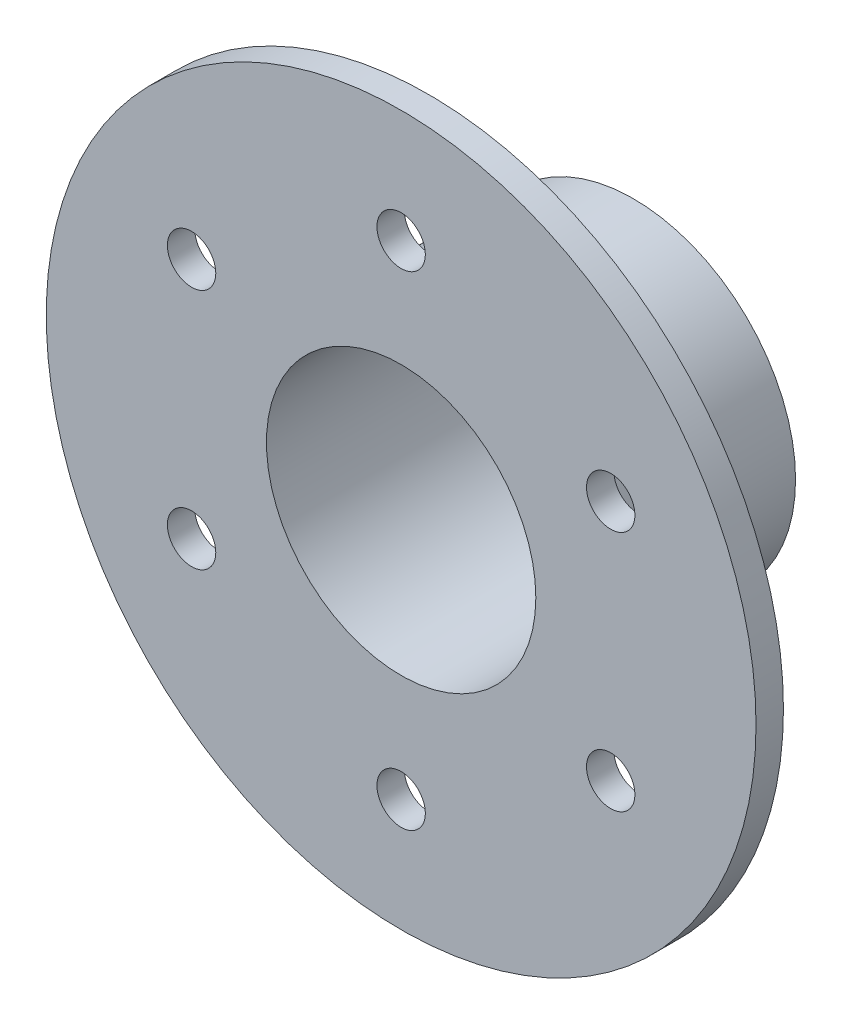
ISO-10303-21;
HEADER;
FILE_DESCRIPTION(('STEP AP214'),'2;1');
FILE_NAME('part.step','',(''),(''),'','','');
FILE_SCHEMA(('AUTOMOTIVE_DESIGN { 1 0 10303 214 1 1 1 1 }'));
ENDSEC;
DATA;
#1=APPLICATION_CONTEXT('core data for automotive mechanical design processes');
#2=APPLICATION_PROTOCOL_DEFINITION('international standard','automotive_design',2000,#1);
#3=PRODUCT_CONTEXT('',#1,'mechanical');
#4=PRODUCT('Part','Part','',(#3));
#5=PRODUCT_RELATED_PRODUCT_CATEGORY('part','',(#4));
#6=PRODUCT_DEFINITION_FORMATION('','',#4);
#7=PRODUCT_DEFINITION_CONTEXT('part definition',#1,'design');
#8=PRODUCT_DEFINITION('design','',#6,#7);
#9=PRODUCT_DEFINITION_SHAPE('','',#8);
#10=(LENGTH_UNIT() NAMED_UNIT(*) SI_UNIT(.MILLI.,.METRE.));
#11=(NAMED_UNIT(*) PLANE_ANGLE_UNIT() SI_UNIT($,.RADIAN.));
#12=(NAMED_UNIT(*) SI_UNIT($,.STERADIAN.) SOLID_ANGLE_UNIT());
#13=UNCERTAINTY_MEASURE_WITH_UNIT(LENGTH_MEASURE(1.E-05),#10,'distance_accuracy_value','');
#14=(GEOMETRIC_REPRESENTATION_CONTEXT(3) GLOBAL_UNCERTAINTY_ASSIGNED_CONTEXT((#13)) GLOBAL_UNIT_ASSIGNED_CONTEXT((#10,
#11,#12)) REPRESENTATION_CONTEXT('',''));
#15=CARTESIAN_POINT('',(0.,0.,0.));
#16=DIRECTION('',(0.,0.,1.));
#17=DIRECTION('',(1.,0.,0.));
#18=AXIS2_PLACEMENT_3D('',#15,#16,#17);
#19=CARTESIAN_POINT('',(0.,0.,0.));
#20=DIRECTION('',(0.,0.,1.));
#21=DIRECTION('',(1.,0.,0.));
#22=AXIS2_PLACEMENT_3D('',#19,#20,#21);
#23=PLANE('',#22);
#24=CARTESIAN_POINT('',(0.,0.,0.));
#25=DIRECTION('',(0.,0.,1.));
#26=DIRECTION('',(1.,0.,0.));
#27=AXIS2_PLACEMENT_3D('',#24,#25,#26);
#28=CIRCLE('',#27,20.1);
#29=CARTESIAN_POINT('',(20.1,0.,0.));
#30=VERTEX_POINT('',#29);
#31=EDGE_CURVE('E35',#30,#30,#28,.T.);
#32=ORIENTED_EDGE('',*,*,#31,.F.);
#33=EDGE_LOOP('',(#32));
#34=FACE_BOUND('',#33,.T.);
#35=CARTESIAN_POINT('',(0.,0.,0.));
#36=DIRECTION('',(0.,0.,1.));
#37=DIRECTION('',(1.,0.,0.));
#38=AXIS2_PLACEMENT_3D('',#35,#36,#37);
#39=CIRCLE('',#38,16.7);
#40=CARTESIAN_POINT('',(16.7,0.,0.));
#41=VERTEX_POINT('',#40);
#42=EDGE_CURVE('E42',#41,#41,#39,.T.);
#43=ORIENTED_EDGE('',*,*,#42,.T.);
#44=EDGE_LOOP('',(#43));
#45=FACE_BOUND('',#44,.T.);
#46=ADVANCED_FACE('F31',(#34,#45),#23,.F.);
#47=CARTESIAN_POINT('',(0.,0.,25.4));
#48=DIRECTION('',(0.,0.,-1.));
#49=DIRECTION('',(-1.,0.,0.));
#50=AXIS2_PLACEMENT_3D('',#47,#48,#49);
#51=CYLINDRICAL_SURFACE('',#50,20.1);
#52=CARTESIAN_POINT('',(0.,0.,25.4));
#53=DIRECTION('',(0.,0.,1.));
#54=DIRECTION('',(1.,0.,0.));
#55=AXIS2_PLACEMENT_3D('',#52,#53,#54);
#56=CIRCLE('',#55,20.1);
#57=CARTESIAN_POINT('',(20.1,0.,25.4));
#58=VERTEX_POINT('',#57);
#59=EDGE_CURVE('E10',#58,#58,#56,.T.);
#60=ORIENTED_EDGE('',*,*,#59,.F.);
#61=EDGE_LOOP('',(#60));
#62=FACE_BOUND('',#61,.T.);
#63=ORIENTED_EDGE('',*,*,#31,.T.);
#64=EDGE_LOOP('',(#63));
#65=FACE_BOUND('',#64,.T.);
#66=ADVANCED_FACE('F33',(#62,#65),#51,.T.);
#67=CARTESIAN_POINT('',(0.,0.,25.4));
#68=DIRECTION('',(0.,0.,-1.));
#69=DIRECTION('',(-1.,0.,0.));
#70=AXIS2_PLACEMENT_3D('',#67,#68,#69);
#71=CYLINDRICAL_SURFACE('',#70,16.7);
#72=ORIENTED_EDGE('',*,*,#42,.F.);
#73=EDGE_LOOP('',(#72));
#74=FACE_BOUND('',#73,.T.);
#75=CARTESIAN_POINT('',(0.,0.,28.8));
#76=DIRECTION('',(0.,0.,1.));
#77=DIRECTION('',(1.,0.,0.));
#78=AXIS2_PLACEMENT_3D('',#75,#76,#77);
#79=CIRCLE('',#78,16.7);
#80=CARTESIAN_POINT('',(16.7,0.,28.8));
#81=VERTEX_POINT('',#80);
#82=EDGE_CURVE('E50',#81,#81,#79,.T.);
#83=ORIENTED_EDGE('',*,*,#82,.T.);
#84=EDGE_LOOP('',(#83));
#85=FACE_BOUND('',#84,.T.);
#86=ADVANCED_FACE('F98',(#74,#85),#71,.F.);
#87=CARTESIAN_POINT('',(0.,0.,28.8));
#88=DIRECTION('',(0.,0.,1.));
#89=DIRECTION('',(1.,0.,0.));
#90=AXIS2_PLACEMENT_3D('',#87,#88,#89);
#91=PLANE('',#90);
#92=CARTESIAN_POINT('',(-25.9807621135306,-15.0000000000015,28.8));
#93=DIRECTION('',(0.,0.,1.));
#94=DIRECTION('',(1.,0.,0.));
#95=AXIS2_PLACEMENT_3D('',#92,#93,#94);
#96=CIRCLE('',#95,3.00000000000316);
#97=CARTESIAN_POINT('',(-22.9807621135274,-15.0000000000015,28.8));
#98=VERTEX_POINT('',#97);
#99=EDGE_CURVE('E77',#98,#98,#96,.T.);
#100=ORIENTED_EDGE('',*,*,#99,.F.);
#101=EDGE_LOOP('',(#100));
#102=FACE_BOUND('',#101,.T.);
#103=CARTESIAN_POINT('',(25.9807621135357,-14.9999999999985,28.8));
#104=DIRECTION('',(0.,0.,1.));
#105=DIRECTION('',(1.,0.,0.));
#106=AXIS2_PLACEMENT_3D('',#103,#104,#105);
#107=CIRCLE('',#106,3.00000000000215);
#108=CARTESIAN_POINT('',(28.9807621135379,-14.9999999999985,28.8));
#109=VERTEX_POINT('',#108);
#110=EDGE_CURVE('E65',#109,#109,#107,.T.);
#111=ORIENTED_EDGE('',*,*,#110,.F.);
#112=EDGE_LOOP('',(#111));
#113=FACE_BOUND('',#112,.T.);
#114=CARTESIAN_POINT('',(25.980762113534,15.0000000000015,28.8));
#115=DIRECTION('',(0.,0.,1.));
#116=DIRECTION('',(1.,0.,0.));
#117=AXIS2_PLACEMENT_3D('',#114,#115,#116);
#118=CIRCLE('',#117,3.00000000000046);
#119=CARTESIAN_POINT('',(28.9807621135345,15.0000000000015,28.8));
#120=VERTEX_POINT('',#119);
#121=EDGE_CURVE('E55',#120,#120,#118,.T.);
#122=ORIENTED_EDGE('',*,*,#121,.F.);
#123=EDGE_LOOP('',(#122));
#124=FACE_BOUND('',#123,.T.);
#125=CARTESIAN_POINT('',(0.,0.,28.8));
#126=DIRECTION('',(0.,0.,1.));
#127=DIRECTION('',(1.,0.,0.));
#128=AXIS2_PLACEMENT_3D('',#125,#126,#127);
#129=CIRCLE('',#128,44.);
#130=CARTESIAN_POINT('',(44.,0.,28.8));
#131=VERTEX_POINT('',#130);
#132=EDGE_CURVE('E46',#131,#131,#129,.T.);
#133=ORIENTED_EDGE('',*,*,#132,.T.);
#134=EDGE_LOOP('',(#133));
#135=FACE_BOUND('',#134,.T.);
#136=ORIENTED_EDGE('',*,*,#82,.F.);
#137=EDGE_LOOP('',(#136));
#138=FACE_BOUND('',#137,.T.);
#139=CARTESIAN_POINT('',(0.,30.,28.8));
#140=DIRECTION('',(0.,0.,1.));
#141=DIRECTION('',(1.,0.,0.));
#142=AXIS2_PLACEMENT_3D('',#139,#140,#141);
#143=CIRCLE('',#142,3.);
#144=CARTESIAN_POINT('',(3.,30.,28.8));
#145=VERTEX_POINT('',#144);
#146=EDGE_CURVE('E59',#145,#145,#143,.T.);
#147=ORIENTED_EDGE('',*,*,#146,.F.);
#148=EDGE_LOOP('',(#147));
#149=FACE_BOUND('',#148,.T.);
#150=CARTESIAN_POINT('',(3.4032572508536E-12,-30.,28.8));
#151=DIRECTION('',(0.,0.,1.));
#152=DIRECTION('',(1.,0.,0.));
#153=AXIS2_PLACEMENT_3D('',#150,#151,#152);
#154=CIRCLE('',#153,3.00000000000345);
#155=CARTESIAN_POINT('',(3.00000000000686,-30.,28.8));
#156=VERTEX_POINT('',#155);
#157=EDGE_CURVE('E71',#156,#156,#154,.T.);
#158=ORIENTED_EDGE('',*,*,#157,.F.);
#159=EDGE_LOOP('',(#158));
#160=FACE_BOUND('',#159,.T.);
#161=CARTESIAN_POINT('',(-25.9807621135323,14.9999999999985,28.8));
#162=DIRECTION('',(0.,0.,1.));
#163=DIRECTION('',(1.,0.,0.));
#164=AXIS2_PLACEMENT_3D('',#161,#162,#163);
#165=CIRCLE('',#164,3.0000000000016);
#166=CARTESIAN_POINT('',(-22.9807621135307,14.9999999999985,28.8));
#167=VERTEX_POINT('',#166);
#168=EDGE_CURVE('E83',#167,#167,#165,.T.);
#169=ORIENTED_EDGE('',*,*,#168,.F.);
#170=EDGE_LOOP('',(#169));
#171=FACE_BOUND('',#170,.T.);
#172=ADVANCED_FACE('F95',(#102,#113,#124,#135,#138,#149,#160,#171),#91,.T.);
#173=CARTESIAN_POINT('',(0.,0.,25.4));
#174=DIRECTION('',(0.,0.,1.));
#175=DIRECTION('',(1.,0.,0.));
#176=AXIS2_PLACEMENT_3D('',#173,#174,#175);
#177=PLANE('',#176);
#178=ORIENTED_EDGE('',*,*,#59,.T.);
#179=EDGE_LOOP('',(#178));
#180=FACE_BOUND('',#179,.T.);
#181=CARTESIAN_POINT('',(0.,0.,25.4));
#182=DIRECTION('',(0.,0.,1.));
#183=DIRECTION('',(1.,0.,0.));
#184=AXIS2_PLACEMENT_3D('',#181,#182,#183);
#185=CIRCLE('',#184,44.);
#186=CARTESIAN_POINT('',(44.,0.,25.4));
#187=VERTEX_POINT('',#186);
#188=EDGE_CURVE('E47',#187,#187,#185,.T.);
#189=ORIENTED_EDGE('',*,*,#188,.F.);
#190=EDGE_LOOP('',(#189));
#191=FACE_BOUND('',#190,.T.);
#192=CARTESIAN_POINT('',(25.980762113534,15.0000000000015,25.4));
#193=DIRECTION('',(0.,0.,1.));
#194=DIRECTION('',(1.,0.,0.));
#195=AXIS2_PLACEMENT_3D('',#192,#193,#194);
#196=CIRCLE('',#195,3.00000000000046);
#197=CARTESIAN_POINT('',(28.9807621135345,15.0000000000015,25.4));
#198=VERTEX_POINT('',#197);
#199=EDGE_CURVE('E56',#198,#198,#196,.T.);
#200=ORIENTED_EDGE('',*,*,#199,.T.);
#201=EDGE_LOOP('',(#200));
#202=FACE_BOUND('',#201,.T.);
#203=CARTESIAN_POINT('',(0.,30.,25.4));
#204=DIRECTION('',(0.,0.,1.));
#205=DIRECTION('',(1.,0.,0.));
#206=AXIS2_PLACEMENT_3D('',#203,#204,#205);
#207=CIRCLE('',#206,3.);
#208=CARTESIAN_POINT('',(3.,30.,25.4));
#209=VERTEX_POINT('',#208);
#210=EDGE_CURVE('E62',#209,#209,#207,.T.);
#211=ORIENTED_EDGE('',*,*,#210,.T.);
#212=EDGE_LOOP('',(#211));
#213=FACE_BOUND('',#212,.T.);
#214=CARTESIAN_POINT('',(25.9807621135357,-14.9999999999985,25.4));
#215=DIRECTION('',(0.,0.,1.));
#216=DIRECTION('',(1.,0.,0.));
#217=AXIS2_PLACEMENT_3D('',#214,#215,#216);
#218=CIRCLE('',#217,3.00000000000215);
#219=CARTESIAN_POINT('',(28.9807621135379,-14.9999999999985,25.4));
#220=VERTEX_POINT('',#219);
#221=EDGE_CURVE('E68',#220,#220,#218,.T.);
#222=ORIENTED_EDGE('',*,*,#221,.T.);
#223=EDGE_LOOP('',(#222));
#224=FACE_BOUND('',#223,.T.);
#225=CARTESIAN_POINT('',(3.4032572508536E-12,-30.,25.4));
#226=DIRECTION('',(0.,0.,1.));
#227=DIRECTION('',(1.,0.,0.));
#228=AXIS2_PLACEMENT_3D('',#225,#226,#227);
#229=CIRCLE('',#228,3.00000000000345);
#230=CARTESIAN_POINT('',(3.00000000000686,-30.,25.4));
#231=VERTEX_POINT('',#230);
#232=EDGE_CURVE('E74',#231,#231,#229,.T.);
#233=ORIENTED_EDGE('',*,*,#232,.T.);
#234=EDGE_LOOP('',(#233));
#235=FACE_BOUND('',#234,.T.);
#236=CARTESIAN_POINT('',(-25.9807621135306,-15.0000000000015,25.4));
#237=DIRECTION('',(0.,0.,1.));
#238=DIRECTION('',(1.,0.,0.));
#239=AXIS2_PLACEMENT_3D('',#236,#237,#238);
#240=CIRCLE('',#239,3.00000000000316);
#241=CARTESIAN_POINT('',(-22.9807621135274,-15.0000000000015,25.4));
#242=VERTEX_POINT('',#241);
#243=EDGE_CURVE('E80',#242,#242,#240,.T.);
#244=ORIENTED_EDGE('',*,*,#243,.T.);
#245=EDGE_LOOP('',(#244));
#246=FACE_BOUND('',#245,.T.);
#247=CARTESIAN_POINT('',(-25.9807621135323,14.9999999999985,25.4));
#248=DIRECTION('',(0.,0.,1.));
#249=DIRECTION('',(1.,0.,0.));
#250=AXIS2_PLACEMENT_3D('',#247,#248,#249);
#251=CIRCLE('',#250,3.0000000000016);
#252=CARTESIAN_POINT('',(-22.9807621135307,14.9999999999985,25.4));
#253=VERTEX_POINT('',#252);
#254=EDGE_CURVE('E86',#253,#253,#251,.T.);
#255=ORIENTED_EDGE('',*,*,#254,.T.);
#256=EDGE_LOOP('',(#255));
#257=FACE_BOUND('',#256,.T.);
#258=ADVANCED_FACE('F97',(#180,#191,#202,#213,#224,#235,#246,#257),#177,.F.);
#259=CARTESIAN_POINT('',(0.,0.,28.8));
#260=DIRECTION('',(0.,0.,-1.));
#261=DIRECTION('',(-1.,0.,0.));
#262=AXIS2_PLACEMENT_3D('',#259,#260,#261);
#263=CYLINDRICAL_SURFACE('',#262,44.);
#264=ORIENTED_EDGE('',*,*,#132,.F.);
#265=EDGE_LOOP('',(#264));
#266=FACE_BOUND('',#265,.T.);
#267=ORIENTED_EDGE('',*,*,#188,.T.);
#268=EDGE_LOOP('',(#267));
#269=FACE_BOUND('',#268,.T.);
#270=ADVANCED_FACE('F105',(#266,#269),#263,.T.);
#271=CARTESIAN_POINT('',(25.980762113534,15.0000000000015,28.8));
#272=DIRECTION('',(0.,0.,-1.));
#273=DIRECTION('',(-1.,0.,0.));
#274=AXIS2_PLACEMENT_3D('',#271,#272,#273);
#275=CYLINDRICAL_SURFACE('',#274,3.00000000000046);
#276=ORIENTED_EDGE('',*,*,#121,.T.);
#277=EDGE_LOOP('',(#276));
#278=FACE_BOUND('',#277,.T.);
#279=ORIENTED_EDGE('',*,*,#199,.F.);
#280=EDGE_LOOP('',(#279));
#281=FACE_BOUND('',#280,.T.);
#282=ADVANCED_FACE('F122',(#278,#281),#275,.F.);
#283=CARTESIAN_POINT('',(0.,30.,28.8));
#284=DIRECTION('',(0.,0.,-1.));
#285=DIRECTION('',(-1.,0.,0.));
#286=AXIS2_PLACEMENT_3D('',#283,#284,#285);
#287=CYLINDRICAL_SURFACE('',#286,3.);
#288=ORIENTED_EDGE('',*,*,#146,.T.);
#289=EDGE_LOOP('',(#288));
#290=FACE_BOUND('',#289,.T.);
#291=ORIENTED_EDGE('',*,*,#210,.F.);
#292=EDGE_LOOP('',(#291));
#293=FACE_BOUND('',#292,.T.);
#294=ADVANCED_FACE('F127',(#290,#293),#287,.F.);
#295=CARTESIAN_POINT('',(25.9807621135357,-14.9999999999985,28.8));
#296=DIRECTION('',(0.,0.,-1.));
#297=DIRECTION('',(-1.,0.,0.));
#298=AXIS2_PLACEMENT_3D('',#295,#296,#297);
#299=CYLINDRICAL_SURFACE('',#298,3.00000000000215);
#300=ORIENTED_EDGE('',*,*,#110,.T.);
#301=EDGE_LOOP('',(#300));
#302=FACE_BOUND('',#301,.T.);
#303=ORIENTED_EDGE('',*,*,#221,.F.);
#304=EDGE_LOOP('',(#303));
#305=FACE_BOUND('',#304,.T.);
#306=ADVANCED_FACE('F157',(#302,#305),#299,.F.);
#307=CARTESIAN_POINT('',(3.4032572508536E-12,-30.,28.8));
#308=DIRECTION('',(0.,0.,-1.));
#309=DIRECTION('',(-1.,0.,0.));
#310=AXIS2_PLACEMENT_3D('',#307,#308,#309);
#311=CYLINDRICAL_SURFACE('',#310,3.00000000000345);
#312=ORIENTED_EDGE('',*,*,#157,.T.);
#313=EDGE_LOOP('',(#312));
#314=FACE_BOUND('',#313,.T.);
#315=ORIENTED_EDGE('',*,*,#232,.F.);
#316=EDGE_LOOP('',(#315));
#317=FACE_BOUND('',#316,.T.);
#318=ADVANCED_FACE('F151',(#314,#317),#311,.F.);
#319=CARTESIAN_POINT('',(-25.9807621135306,-15.0000000000015,28.8));
#320=DIRECTION('',(0.,0.,-1.));
#321=DIRECTION('',(-1.,0.,0.));
#322=AXIS2_PLACEMENT_3D('',#319,#320,#321);
#323=CYLINDRICAL_SURFACE('',#322,3.00000000000316);
#324=ORIENTED_EDGE('',*,*,#99,.T.);
#325=EDGE_LOOP('',(#324));
#326=FACE_BOUND('',#325,.T.);
#327=ORIENTED_EDGE('',*,*,#243,.F.);
#328=EDGE_LOOP('',(#327));
#329=FACE_BOUND('',#328,.T.);
#330=ADVANCED_FACE('F146',(#326,#329),#323,.F.);
#331=CARTESIAN_POINT('',(-25.9807621135323,14.9999999999985,28.8));
#332=DIRECTION('',(0.,0.,-1.));
#333=DIRECTION('',(-1.,0.,0.));
#334=AXIS2_PLACEMENT_3D('',#331,#332,#333);
#335=CYLINDRICAL_SURFACE('',#334,3.0000000000016);
#336=ORIENTED_EDGE('',*,*,#168,.T.);
#337=EDGE_LOOP('',(#336));
#338=FACE_BOUND('',#337,.T.);
#339=ORIENTED_EDGE('',*,*,#254,.F.);
#340=EDGE_LOOP('',(#339));
#341=FACE_BOUND('',#340,.T.);
#342=ADVANCED_FACE('F92',(#338,#341),#335,.F.);
#343=CLOSED_SHELL('',(#46,#66,#86,#172,#258,#270,#282,#294,#306,#318,#330,#342));
#344=MANIFOLD_SOLID_BREP('B2',#343);
#345=ADVANCED_BREP_SHAPE_REPRESENTATION('',(#18,#344),#14);
#346=SHAPE_DEFINITION_REPRESENTATION(#9,#345);
ENDSEC;
END-ISO-10303-21;
